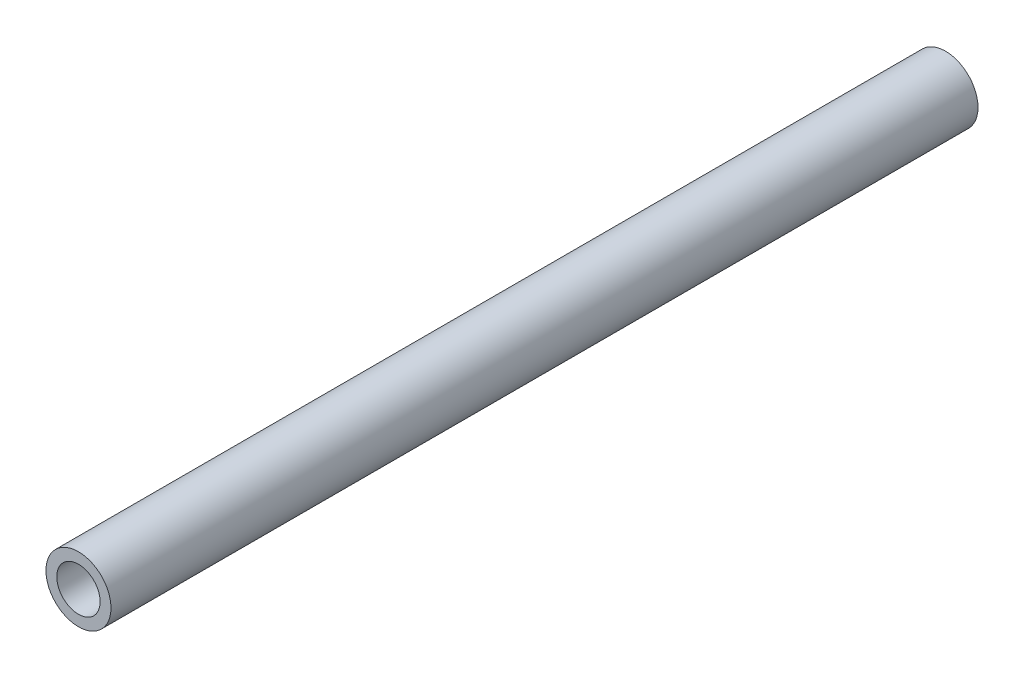
ISO-10303-21;
HEADER;
FILE_DESCRIPTION(('STEP AP214'),'2;1');
FILE_NAME('part.step','',(''),(''),'','','');
FILE_SCHEMA(('AUTOMOTIVE_DESIGN { 1 0 10303 214 1 1 1 1 }'));
ENDSEC;
DATA;
#1=APPLICATION_CONTEXT('core data for automotive mechanical design processes');
#2=APPLICATION_PROTOCOL_DEFINITION('international standard','automotive_design',2000,#1);
#3=PRODUCT_CONTEXT('',#1,'mechanical');
#4=PRODUCT('Part','Part','',(#3));
#5=PRODUCT_RELATED_PRODUCT_CATEGORY('part','',(#4));
#6=PRODUCT_DEFINITION_FORMATION('','',#4);
#7=PRODUCT_DEFINITION_CONTEXT('part definition',#1,'design');
#8=PRODUCT_DEFINITION('design','',#6,#7);
#9=PRODUCT_DEFINITION_SHAPE('','',#8);
#10=(LENGTH_UNIT() NAMED_UNIT(*) SI_UNIT(.MILLI.,.METRE.));
#11=(NAMED_UNIT(*) PLANE_ANGLE_UNIT() SI_UNIT($,.RADIAN.));
#12=(NAMED_UNIT(*) SI_UNIT($,.STERADIAN.) SOLID_ANGLE_UNIT());
#13=UNCERTAINTY_MEASURE_WITH_UNIT(LENGTH_MEASURE(1.E-05),#10,'distance_accuracy_value','');
#14=(GEOMETRIC_REPRESENTATION_CONTEXT(3) GLOBAL_UNCERTAINTY_ASSIGNED_CONTEXT((#13)) GLOBAL_UNIT_ASSIGNED_CONTEXT((#10,
#11,#12)) REPRESENTATION_CONTEXT('',''));
#15=CARTESIAN_POINT('',(0.,0.,0.));
#16=DIRECTION('',(0.,0.,1.));
#17=DIRECTION('',(1.,0.,0.));
#18=AXIS2_PLACEMENT_3D('',#15,#16,#17);
#19=CARTESIAN_POINT('',(0.,0.,200.));
#20=DIRECTION('',(0.,0.,1.));
#21=DIRECTION('',(1.,0.,0.));
#22=AXIS2_PLACEMENT_3D('',#19,#20,#21);
#23=PLANE('',#22);
#24=CARTESIAN_POINT('',(0.,0.,200.));
#25=DIRECTION('',(0.,0.,1.));
#26=DIRECTION('',(1.,0.,0.));
#27=AXIS2_PLACEMENT_3D('',#24,#25,#26);
#28=CIRCLE('',#27,7.5);
#29=CARTESIAN_POINT('',(7.5,0.,200.));
#30=VERTEX_POINT('',#29);
#31=EDGE_CURVE('E10',#30,#30,#28,.T.);
#32=ORIENTED_EDGE('',*,*,#31,.T.);
#33=EDGE_LOOP('',(#32));
#34=FACE_BOUND('',#33,.T.);
#35=CARTESIAN_POINT('',(0.,0.,200.));
#36=DIRECTION('',(0.,0.,1.));
#37=DIRECTION('',(1.,0.,0.));
#38=AXIS2_PLACEMENT_3D('',#35,#36,#37);
#39=CIRCLE('',#38,5.);
#40=CARTESIAN_POINT('',(5.,0.,200.));
#41=VERTEX_POINT('',#40);
#42=EDGE_CURVE('E50',#41,#41,#39,.T.);
#43=ORIENTED_EDGE('',*,*,#42,.F.);
#44=EDGE_LOOP('',(#43));
#45=FACE_BOUND('',#44,.T.);
#46=ADVANCED_FACE('F37',(#34,#45),#23,.T.);
#47=CARTESIAN_POINT('',(0.,0.,0.));
#48=DIRECTION('',(0.,0.,1.));
#49=DIRECTION('',(1.,0.,0.));
#50=AXIS2_PLACEMENT_3D('',#47,#48,#49);
#51=PLANE('',#50);
#52=CARTESIAN_POINT('',(0.,0.,0.));
#53=DIRECTION('',(0.,0.,1.));
#54=DIRECTION('',(1.,0.,0.));
#55=AXIS2_PLACEMENT_3D('',#52,#53,#54);
#56=CIRCLE('',#55,7.5);
#57=CARTESIAN_POINT('',(7.5,0.,0.));
#58=VERTEX_POINT('',#57);
#59=EDGE_CURVE('E41',#58,#58,#56,.T.);
#60=ORIENTED_EDGE('',*,*,#59,.F.);
#61=EDGE_LOOP('',(#60));
#62=FACE_BOUND('',#61,.T.);
#63=CARTESIAN_POINT('',(0.,0.,0.));
#64=DIRECTION('',(0.,0.,1.));
#65=DIRECTION('',(1.,0.,0.));
#66=AXIS2_PLACEMENT_3D('',#63,#64,#65);
#67=CIRCLE('',#66,5.);
#68=CARTESIAN_POINT('',(5.,0.,0.));
#69=VERTEX_POINT('',#68);
#70=EDGE_CURVE('E52',#69,#69,#67,.T.);
#71=ORIENTED_EDGE('',*,*,#70,.T.);
#72=EDGE_LOOP('',(#71));
#73=FACE_BOUND('',#72,.T.);
#74=ADVANCED_FACE('F64',(#62,#73),#51,.F.);
#75=CARTESIAN_POINT('',(0.,0.,200.));
#76=DIRECTION('',(0.,0.,-1.));
#77=DIRECTION('',(-1.,0.,0.));
#78=AXIS2_PLACEMENT_3D('',#75,#76,#77);
#79=CYLINDRICAL_SURFACE('',#78,7.5);
#80=ORIENTED_EDGE('',*,*,#31,.F.);
#81=EDGE_LOOP('',(#80));
#82=FACE_BOUND('',#81,.T.);
#83=ORIENTED_EDGE('',*,*,#59,.T.);
#84=EDGE_LOOP('',(#83));
#85=FACE_BOUND('',#84,.T.);
#86=ADVANCED_FACE('F39',(#82,#85),#79,.T.);
#87=CARTESIAN_POINT('',(0.,0.,200.));
#88=DIRECTION('',(0.,0.,-1.));
#89=DIRECTION('',(-1.,0.,0.));
#90=AXIS2_PLACEMENT_3D('',#87,#88,#89);
#91=CYLINDRICAL_SURFACE('',#90,5.);
#92=ORIENTED_EDGE('',*,*,#42,.T.);
#93=EDGE_LOOP('',(#92));
#94=FACE_BOUND('',#93,.T.);
#95=ORIENTED_EDGE('',*,*,#70,.F.);
#96=EDGE_LOOP('',(#95));
#97=FACE_BOUND('',#96,.T.);
#98=ADVANCED_FACE('F60',(#94,#97),#91,.F.);
#99=CLOSED_SHELL('',(#46,#74,#86,#98));
#100=MANIFOLD_SOLID_BREP('B2',#99);
#101=ADVANCED_BREP_SHAPE_REPRESENTATION('',(#18,#100),#14);
#102=SHAPE_DEFINITION_REPRESENTATION(#9,#101);
ENDSEC;
END-ISO-10303-21;
